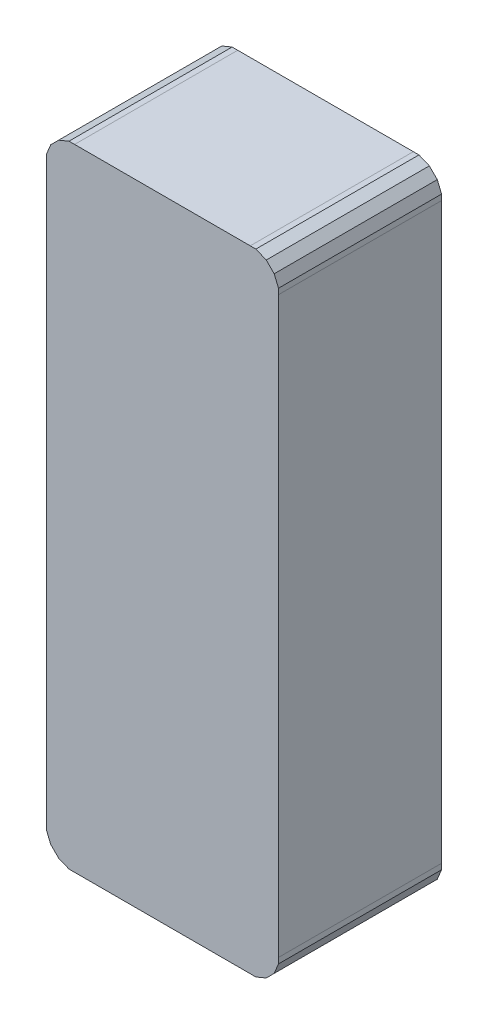
ISO-10303-21;
HEADER;
FILE_DESCRIPTION(('STEP AP214'),'2;1');
FILE_NAME('part.step','',(''),(''),'','','');
FILE_SCHEMA(('AUTOMOTIVE_DESIGN { 1 0 10303 214 1 1 1 1 }'));
ENDSEC;
DATA;
#1=APPLICATION_CONTEXT('core data for automotive mechanical design processes');
#2=APPLICATION_PROTOCOL_DEFINITION('international standard','automotive_design',2000,#1);
#3=PRODUCT_CONTEXT('',#1,'mechanical');
#4=PRODUCT('Part','Part','',(#3));
#5=PRODUCT_RELATED_PRODUCT_CATEGORY('part','',(#4));
#6=PRODUCT_DEFINITION_FORMATION('','',#4);
#7=PRODUCT_DEFINITION_CONTEXT('part definition',#1,'design');
#8=PRODUCT_DEFINITION('design','',#6,#7);
#9=PRODUCT_DEFINITION_SHAPE('','',#8);
#10=(LENGTH_UNIT() NAMED_UNIT(*) SI_UNIT(.MILLI.,.METRE.));
#11=(NAMED_UNIT(*) PLANE_ANGLE_UNIT() SI_UNIT($,.RADIAN.));
#12=(NAMED_UNIT(*) SI_UNIT($,.STERADIAN.) SOLID_ANGLE_UNIT());
#13=UNCERTAINTY_MEASURE_WITH_UNIT(LENGTH_MEASURE(1.E-05),#10,'distance_accuracy_value','');
#14=(GEOMETRIC_REPRESENTATION_CONTEXT(3) GLOBAL_UNCERTAINTY_ASSIGNED_CONTEXT((#13)) GLOBAL_UNIT_ASSIGNED_CONTEXT((#10,
#11,#12)) REPRESENTATION_CONTEXT('',''));
#15=CARTESIAN_POINT('',(0.,0.,0.));
#16=DIRECTION('',(0.,0.,1.));
#17=DIRECTION('',(1.,0.,0.));
#18=AXIS2_PLACEMENT_3D('',#15,#16,#17);
#19=CARTESIAN_POINT('',(1.84928002,-4.57546202,0.));
#20=DIRECTION('',(0.999999993544122,0.000113629906682714,0.));
#21=DIRECTION('',(0.000113629906682714,-0.999999993544122,0.));
#22=AXIS2_PLACEMENT_3D('',#19,#20,#21);
#23=PLANE('',#22);
#24=DIRECTION('',(0.,0.,1.));
#25=VECTOR('',#24,1.);
#26=CARTESIAN_POINT('',(1.84928002,-4.57546202,0.));
#27=LINE('',#26,#25);
#28=CARTESIAN_POINT('',(1.84928002,-4.57546202,0.));
#29=VERTEX_POINT('',#28);
#30=CARTESIAN_POINT('',(1.84928002,-4.57546202,2.59999988));
#31=VERTEX_POINT('',#30);
#32=EDGE_CURVE('E11',#29,#31,#27,.T.);
#33=ORIENTED_EDGE('',*,*,#32,.T.);
#34=DIRECTION('',(0.000113629906682714,-0.999999993544122,0.));
#35=VECTOR('',#34,1.);
#36=CARTESIAN_POINT('',(1.84928002,-4.57546202,2.59999988));
#37=LINE('',#36,#35);
#38=CARTESIAN_POINT('',(1.84929018,-4.6648751,2.59999988));
#39=VERTEX_POINT('',#38);
#40=EDGE_CURVE('E24',#31,#39,#37,.T.);
#41=ORIENTED_EDGE('',*,*,#40,.T.);
#42=DIRECTION('',(0.,0.,1.));
#43=VECTOR('',#42,1.);
#44=CARTESIAN_POINT('',(1.84929018,-4.6648751,0.));
#45=LINE('',#44,#43);
#46=CARTESIAN_POINT('',(1.84929018,-4.6648751,0.));
#47=VERTEX_POINT('',#46);
#48=EDGE_CURVE('E421',#47,#39,#45,.T.);
#49=ORIENTED_EDGE('',*,*,#48,.F.);
#50=DIRECTION('',(0.000113629906682714,-0.999999993544122,0.));
#51=VECTOR('',#50,1.);
#52=CARTESIAN_POINT('',(1.84928002,-4.57546202,0.));
#53=LINE('',#52,#51);
#54=EDGE_CURVE('E419',#29,#47,#53,.T.);
#55=ORIENTED_EDGE('',*,*,#54,.F.);
#56=EDGE_LOOP('',(#33,#41,#49,#55));
#57=FACE_BOUND('',#56,.T.);
#58=ADVANCED_FACE('F17',(#57),#23,.T.);
#59=CARTESIAN_POINT('',(1.84929018,-4.6648751,0.));
#60=DIRECTION('',(0.923919378216461,-0.382587222154777,0.));
#61=DIRECTION('',(-0.382587222154777,-0.923919378216461,0.));
#62=AXIS2_PLACEMENT_3D('',#59,#60,#61);
#63=PLANE('',#62);
#64=ORIENTED_EDGE('',*,*,#48,.T.);
#65=DIRECTION('',(-0.382587222154777,-0.923919378216461,0.));
#66=VECTOR('',#65,1.);
#67=CARTESIAN_POINT('',(1.84929018,-4.6648751,2.59999988));
#68=LINE('',#67,#66);
#69=CARTESIAN_POINT('',(1.78087528,-4.83009194,2.59999988));
#70=VERTEX_POINT('',#69);
#71=EDGE_CURVE('E417',#39,#70,#68,.T.);
#72=ORIENTED_EDGE('',*,*,#71,.T.);
#73=DIRECTION('',(0.,0.,1.));
#74=VECTOR('',#73,1.);
#75=CARTESIAN_POINT('',(1.78087528,-4.83009194,0.));
#76=LINE('',#75,#74);
#77=CARTESIAN_POINT('',(1.78087528,-4.83009194,0.));
#78=VERTEX_POINT('',#77);
#79=EDGE_CURVE('E414',#78,#70,#76,.T.);
#80=ORIENTED_EDGE('',*,*,#79,.F.);
#81=DIRECTION('',(-0.382587222154777,-0.923919378216461,0.));
#82=VECTOR('',#81,1.);
#83=CARTESIAN_POINT('',(1.84929018,-4.6648751,0.));
#84=LINE('',#83,#82);
#85=EDGE_CURVE('E411',#47,#78,#84,.T.);
#86=ORIENTED_EDGE('',*,*,#85,.F.);
#87=EDGE_LOOP('',(#64,#72,#80,#86));
#88=FACE_BOUND('',#87,.T.);
#89=ADVANCED_FACE('F427',(#88),#63,.T.);
#90=CARTESIAN_POINT('',(1.78087528,-4.83009194,0.));
#91=DIRECTION('',(0.707163595164945,-0.707049962642945,0.));
#92=DIRECTION('',(-0.707049962642945,-0.707163595164945,0.));
#93=AXIS2_PLACEMENT_3D('',#90,#91,#92);
#94=PLANE('',#93);
#95=ORIENTED_EDGE('',*,*,#79,.T.);
#96=DIRECTION('',(-0.707049962642945,-0.707163595164945,0.));
#97=VECTOR('',#96,1.);
#98=CARTESIAN_POINT('',(1.78087528,-4.83009194,2.59999988));
#99=LINE('',#98,#97);
#100=CARTESIAN_POINT('',(1.65443916,-4.95654838,2.59999988));
#101=VERTEX_POINT('',#100);
#102=EDGE_CURVE('E409',#70,#101,#99,.T.);
#103=ORIENTED_EDGE('',*,*,#102,.T.);
#104=DIRECTION('',(0.,0.,1.));
#105=VECTOR('',#104,1.);
#106=CARTESIAN_POINT('',(1.65443916,-4.95654838,0.));
#107=LINE('',#106,#105);
#108=CARTESIAN_POINT('',(1.65443916,-4.95654838,0.));
#109=VERTEX_POINT('',#108);
#110=EDGE_CURVE('E406',#109,#101,#107,.T.);
#111=ORIENTED_EDGE('',*,*,#110,.F.);
#112=DIRECTION('',(-0.707049962642945,-0.707163595164945,0.));
#113=VECTOR('',#112,1.);
#114=CARTESIAN_POINT('',(1.78087528,-4.83009194,0.));
#115=LINE('',#114,#113);
#116=EDGE_CURVE('E403',#78,#109,#115,.T.);
#117=ORIENTED_EDGE('',*,*,#116,.F.);
#118=EDGE_LOOP('',(#95,#103,#111,#117));
#119=FACE_BOUND('',#118,.T.);
#120=ADVANCED_FACE('F433',(#119),#94,.T.);
#121=CARTESIAN_POINT('',(1.65443916,-4.95654838,0.));
#122=DIRECTION('',(0.382745696709142,-0.923853739317341,0.));
#123=DIRECTION('',(-0.923853739317341,-0.382745696709142,0.));
#124=AXIS2_PLACEMENT_3D('',#121,#122,#123);
#125=PLANE('',#124);
#126=ORIENTED_EDGE('',*,*,#110,.T.);
#127=DIRECTION('',(-0.923853739317341,-0.382745696709142,0.));
#128=VECTOR('',#127,1.);
#129=CARTESIAN_POINT('',(1.65443916,-4.95654838,2.59999988));
#130=LINE('',#129,#128);
#131=CARTESIAN_POINT('',(1.48923502,-5.02499122,2.59999988));
#132=VERTEX_POINT('',#131);
#133=EDGE_CURVE('E401',#101,#132,#130,.T.);
#134=ORIENTED_EDGE('',*,*,#133,.T.);
#135=DIRECTION('',(0.,0.,1.));
#136=VECTOR('',#135,1.);
#137=CARTESIAN_POINT('',(1.48923502,-5.02499122,0.));
#138=LINE('',#137,#136);
#139=CARTESIAN_POINT('',(1.48923502,-5.02499122,0.));
#140=VERTEX_POINT('',#139);
#141=EDGE_CURVE('E398',#140,#132,#138,.T.);
#142=ORIENTED_EDGE('',*,*,#141,.F.);
#143=DIRECTION('',(-0.923853739317341,-0.382745696709142,0.));
#144=VECTOR('',#143,1.);
#145=CARTESIAN_POINT('',(1.65443916,-4.95654838,0.));
#146=LINE('',#145,#144);
#147=EDGE_CURVE('E395',#109,#140,#146,.T.);
#148=ORIENTED_EDGE('',*,*,#147,.F.);
#149=EDGE_LOOP('',(#126,#134,#142,#148));
#150=FACE_BOUND('',#149,.T.);
#151=ADVANCED_FACE('F437',(#150),#125,.T.);
#152=CARTESIAN_POINT('',(1.48923502,-5.02499122,0.));
#153=DIRECTION('',(2.8407476882316E-05,-0.999999999596508,0.));
#154=DIRECTION('',(-0.999999999596508,-2.8407476882316E-05,0.));
#155=AXIS2_PLACEMENT_3D('',#152,#153,#154);
#156=PLANE('',#155);
#157=ORIENTED_EDGE('',*,*,#141,.T.);
#158=DIRECTION('',(-0.999999999596508,-2.8407476882316E-05,0.));
#159=VECTOR('',#158,1.);
#160=CARTESIAN_POINT('',(1.48923502,-5.02499122,2.59999988));
#161=LINE('',#160,#159);
#162=CARTESIAN_POINT('',(1.39982194,-5.02499376,2.59999988));
#163=VERTEX_POINT('',#162);
#164=EDGE_CURVE('E393',#132,#163,#161,.T.);
#165=ORIENTED_EDGE('',*,*,#164,.T.);
#166=DIRECTION('',(0.,0.,1.));
#167=VECTOR('',#166,1.);
#168=CARTESIAN_POINT('',(1.39982194,-5.02499376,0.));
#169=LINE('',#168,#167);
#170=CARTESIAN_POINT('',(1.39982194,-5.02499376,0.));
#171=VERTEX_POINT('',#170);
#172=EDGE_CURVE('E390',#171,#163,#169,.T.);
#173=ORIENTED_EDGE('',*,*,#172,.F.);
#174=DIRECTION('',(-0.999999999596508,-2.8407476882316E-05,0.));
#175=VECTOR('',#174,1.);
#176=CARTESIAN_POINT('',(1.48923502,-5.02499122,0.));
#177=LINE('',#176,#175);
#178=EDGE_CURVE('E387',#140,#171,#177,.T.);
#179=ORIENTED_EDGE('',*,*,#178,.F.);
#180=EDGE_LOOP('',(#157,#165,#173,#179));
#181=FACE_BOUND('',#180,.T.);
#182=ADVANCED_FACE('F441',(#181),#156,.T.);
#183=CARTESIAN_POINT('',(1.39982194,-5.02499376,0.));
#184=DIRECTION('',(0.0830454797384208,-0.99654575825449,0.));
#185=DIRECTION('',(-0.99654575825449,-0.0830454797384208,0.));
#186=AXIS2_PLACEMENT_3D('',#183,#184,#185);
#187=PLANE('',#186);
#188=ORIENTED_EDGE('',*,*,#172,.T.);
#189=DIRECTION('',(-0.99654575825449,-0.0830454797384208,0.));
#190=VECTOR('',#189,1.);
#191=CARTESIAN_POINT('',(1.39982194,-5.02499376,2.59999988));
#192=LINE('',#191,#190);
#193=CARTESIAN_POINT('',(1.39979146,-5.0249963,2.59999988));
#194=VERTEX_POINT('',#193);
#195=EDGE_CURVE('E385',#163,#194,#192,.T.);
#196=ORIENTED_EDGE('',*,*,#195,.T.);
#197=DIRECTION('',(0.,0.,1.));
#198=VECTOR('',#197,1.);
#199=CARTESIAN_POINT('',(1.39979146,-5.0249963,0.));
#200=LINE('',#199,#198);
#201=CARTESIAN_POINT('',(1.39979146,-5.0249963,0.));
#202=VERTEX_POINT('',#201);
#203=EDGE_CURVE('E382',#202,#194,#200,.T.);
#204=ORIENTED_EDGE('',*,*,#203,.F.);
#205=DIRECTION('',(-0.99654575825449,-0.0830454797384208,0.));
#206=VECTOR('',#205,1.);
#207=CARTESIAN_POINT('',(1.39982194,-5.02499376,0.));
#208=LINE('',#207,#206);
#209=EDGE_CURVE('E379',#171,#202,#208,.T.);
#210=ORIENTED_EDGE('',*,*,#209,.F.);
#211=EDGE_LOOP('',(#188,#196,#204,#210));
#212=FACE_BOUND('',#211,.T.);
#213=ADVANCED_FACE('F444',(#212),#187,.T.);
#214=CARTESIAN_POINT('',(1.39979146,-5.0249963,0.));
#215=DIRECTION('',(0.,-1.,0.));
#216=DIRECTION('',(-1.,0.,0.));
#217=AXIS2_PLACEMENT_3D('',#214,#215,#216);
#218=PLANE('',#217);
#219=ORIENTED_EDGE('',*,*,#203,.T.);
#220=DIRECTION('',(-1.,0.,0.));
#221=VECTOR('',#220,1.);
#222=CARTESIAN_POINT('',(1.39979146,-5.0249963,2.59999988));
#223=LINE('',#222,#221);
#224=CARTESIAN_POINT('',(-1.40021056,-5.0249963,2.59999988));
#225=VERTEX_POINT('',#224);
#226=EDGE_CURVE('E377',#194,#225,#223,.T.);
#227=ORIENTED_EDGE('',*,*,#226,.T.);
#228=DIRECTION('',(0.,0.,1.));
#229=VECTOR('',#228,1.);
#230=CARTESIAN_POINT('',(-1.40021056,-5.0249963,0.));
#231=LINE('',#230,#229);
#232=CARTESIAN_POINT('',(-1.40021056,-5.0249963,0.));
#233=VERTEX_POINT('',#232);
#234=EDGE_CURVE('E374',#233,#225,#231,.T.);
#235=ORIENTED_EDGE('',*,*,#234,.F.);
#236=DIRECTION('',(-1.,0.,0.));
#237=VECTOR('',#236,1.);
#238=CARTESIAN_POINT('',(1.39979146,-5.0249963,0.));
#239=LINE('',#238,#237);
#240=EDGE_CURVE('E371',#202,#233,#239,.T.);
#241=ORIENTED_EDGE('',*,*,#240,.F.);
#242=EDGE_LOOP('',(#219,#227,#235,#241));
#243=FACE_BOUND('',#242,.T.);
#244=ADVANCED_FACE('F449',(#243),#218,.T.);
#245=CARTESIAN_POINT('',(-1.40021056,-5.0249963,0.));
#246=DIRECTION('',(2.84098979634325E-05,-0.999999999596439,0.));
#247=DIRECTION('',(-0.999999999596439,-2.84098979634325E-05,0.));
#248=AXIS2_PLACEMENT_3D('',#245,#246,#247);
#249=PLANE('',#248);
#250=ORIENTED_EDGE('',*,*,#234,.T.);
#251=DIRECTION('',(-0.999999999596439,-2.84098979634325E-05,0.));
#252=VECTOR('',#251,1.);
#253=CARTESIAN_POINT('',(-1.40021056,-5.0249963,2.59999988));
#254=LINE('',#253,#252);
#255=CARTESIAN_POINT('',(-1.48961602,-5.02499884,2.59999988));
#256=VERTEX_POINT('',#255);
#257=EDGE_CURVE('E369',#225,#256,#254,.T.);
#258=ORIENTED_EDGE('',*,*,#257,.T.);
#259=DIRECTION('',(0.,0.,1.));
#260=VECTOR('',#259,1.);
#261=CARTESIAN_POINT('',(-1.48961602,-5.02499884,0.));
#262=LINE('',#261,#260);
#263=CARTESIAN_POINT('',(-1.48961602,-5.02499884,0.));
#264=VERTEX_POINT('',#263);
#265=EDGE_CURVE('E366',#264,#256,#262,.T.);
#266=ORIENTED_EDGE('',*,*,#265,.F.);
#267=DIRECTION('',(-0.999999999596439,-2.84098979634325E-05,0.));
#268=VECTOR('',#267,1.);
#269=CARTESIAN_POINT('',(-1.40021056,-5.0249963,0.));
#270=LINE('',#269,#268);
#271=EDGE_CURVE('E363',#233,#264,#270,.T.);
#272=ORIENTED_EDGE('',*,*,#271,.F.);
#273=EDGE_LOOP('',(#250,#258,#266,#272));
#274=FACE_BOUND('',#273,.T.);
#275=ADVANCED_FACE('F453',(#274),#249,.T.);
#276=CARTESIAN_POINT('',(-1.48961602,-5.02499884,0.));
#277=DIRECTION('',(-0.382685077513852,-0.923878851066642,0.));
#278=DIRECTION('',(-0.923878851066642,0.382685077513852,0.));
#279=AXIS2_PLACEMENT_3D('',#276,#277,#278);
#280=PLANE('',#279);
#281=ORIENTED_EDGE('',*,*,#265,.T.);
#282=DIRECTION('',(-0.923878851066642,0.382685077513852,0.));
#283=VECTOR('',#282,1.);
#284=CARTESIAN_POINT('',(-1.48961602,-5.02499884,2.59999988));
#285=LINE('',#284,#283);
#286=CARTESIAN_POINT('',(-1.65482016,-4.9565687,2.59999988));
#287=VERTEX_POINT('',#286);
#288=EDGE_CURVE('E361',#256,#287,#285,.T.);
#289=ORIENTED_EDGE('',*,*,#288,.T.);
#290=DIRECTION('',(0.,0.,1.));
#291=VECTOR('',#290,1.);
#292=CARTESIAN_POINT('',(-1.65482016,-4.9565687,0.));
#293=LINE('',#292,#291);
#294=CARTESIAN_POINT('',(-1.65482016,-4.9565687,0.));
#295=VERTEX_POINT('',#294);
#296=EDGE_CURVE('E358',#295,#287,#293,.T.);
#297=ORIENTED_EDGE('',*,*,#296,.F.);
#298=DIRECTION('',(-0.923878851066642,0.382685077513852,0.));
#299=VECTOR('',#298,1.);
#300=CARTESIAN_POINT('',(-1.48961602,-5.02499884,0.));
#301=LINE('',#300,#299);
#302=EDGE_CURVE('E355',#264,#295,#301,.T.);
#303=ORIENTED_EDGE('',*,*,#302,.F.);
#304=EDGE_LOOP('',(#281,#289,#297,#303));
#305=FACE_BOUND('',#304,.T.);
#306=ADVANCED_FACE('F457',(#305),#280,.T.);
#307=CARTESIAN_POINT('',(-1.65482016,-4.9565687,0.));
#308=DIRECTION('',(-0.707106781186548,-0.707106781186548,0.));
#309=DIRECTION('',(-0.707106781186548,0.707106781186548,0.));
#310=AXIS2_PLACEMENT_3D('',#307,#308,#309);
#311=PLANE('',#310);
#312=ORIENTED_EDGE('',*,*,#296,.T.);
#313=DIRECTION('',(-0.707106781186548,0.707106781186548,0.));
#314=VECTOR('',#313,1.);
#315=CARTESIAN_POINT('',(-1.65482016,-4.9565687,2.59999988));
#316=LINE('',#315,#314);
#317=CARTESIAN_POINT('',(-1.78126136,-4.8301275,2.59999988));
#318=VERTEX_POINT('',#317);
#319=EDGE_CURVE('E353',#287,#318,#316,.T.);
#320=ORIENTED_EDGE('',*,*,#319,.T.);
#321=DIRECTION('',(0.,0.,1.));
#322=VECTOR('',#321,1.);
#323=CARTESIAN_POINT('',(-1.78126136,-4.8301275,0.));
#324=LINE('',#323,#322);
#325=CARTESIAN_POINT('',(-1.78126136,-4.8301275,0.));
#326=VERTEX_POINT('',#325);
#327=EDGE_CURVE('E350',#326,#318,#324,.T.);
#328=ORIENTED_EDGE('',*,*,#327,.F.);
#329=DIRECTION('',(-0.707106781186548,0.707106781186548,0.));
#330=VECTOR('',#329,1.);
#331=CARTESIAN_POINT('',(-1.65482016,-4.9565687,0.));
#332=LINE('',#331,#330);
#333=EDGE_CURVE('E347',#295,#326,#332,.T.);
#334=ORIENTED_EDGE('',*,*,#333,.F.);
#335=EDGE_LOOP('',(#312,#320,#328,#334));
#336=FACE_BOUND('',#335,.T.);
#337=ADVANCED_FACE('F460',(#336),#311,.T.);
#338=CARTESIAN_POINT('',(-1.78126136,-4.8301275,0.));
#339=DIRECTION('',(-0.923878851066642,-0.382685077513852,0.));
#340=DIRECTION('',(-0.382685077513852,0.923878851066642,0.));
#341=AXIS2_PLACEMENT_3D('',#338,#339,#340);
#342=PLANE('',#341);
#343=ORIENTED_EDGE('',*,*,#327,.T.);
#344=DIRECTION('',(-0.382685077513852,0.923878851066642,0.));
#345=VECTOR('',#344,1.);
#346=CARTESIAN_POINT('',(-1.78126136,-4.8301275,2.59999988));
#347=LINE('',#346,#345);
#348=CARTESIAN_POINT('',(-1.8496915,-4.66492336,2.59999988));
#349=VERTEX_POINT('',#348);
#350=EDGE_CURVE('E345',#318,#349,#347,.T.);
#351=ORIENTED_EDGE('',*,*,#350,.T.);
#352=DIRECTION('',(0.,0.,1.));
#353=VECTOR('',#352,1.);
#354=CARTESIAN_POINT('',(-1.8496915,-4.66492336,0.));
#355=LINE('',#354,#353);
#356=CARTESIAN_POINT('',(-1.8496915,-4.66492336,0.));
#357=VERTEX_POINT('',#356);
#358=EDGE_CURVE('E342',#357,#349,#355,.T.);
#359=ORIENTED_EDGE('',*,*,#358,.F.);
#360=DIRECTION('',(-0.382685077513852,0.923878851066642,0.));
#361=VECTOR('',#360,1.);
#362=CARTESIAN_POINT('',(-1.78126136,-4.8301275,0.));
#363=LINE('',#362,#361);
#364=EDGE_CURVE('E339',#326,#357,#363,.T.);
#365=ORIENTED_EDGE('',*,*,#364,.F.);
#366=EDGE_LOOP('',(#343,#351,#359,#365));
#367=FACE_BOUND('',#366,.T.);
#368=ADVANCED_FACE('F465',(#367),#342,.T.);
#369=CARTESIAN_POINT('',(-1.8496915,-4.66492336,0.));
#370=DIRECTION('',(-0.999999999596462,2.84090908640631E-05,0.));
#371=DIRECTION('',(2.84090908640631E-05,0.999999999596462,0.));
#372=AXIS2_PLACEMENT_3D('',#369,#370,#371);
#373=PLANE('',#372);
#374=ORIENTED_EDGE('',*,*,#358,.T.);
#375=DIRECTION('',(2.84090908640631E-05,0.999999999596462,0.));
#376=VECTOR('',#375,1.);
#377=CARTESIAN_POINT('',(-1.8496915,-4.66492336,2.59999988));
#378=LINE('',#377,#376);
#379=CARTESIAN_POINT('',(-1.84968896,-4.57551536,2.59999988));
#380=VERTEX_POINT('',#379);
#381=EDGE_CURVE('E337',#349,#380,#378,.T.);
#382=ORIENTED_EDGE('',*,*,#381,.T.);
#383=DIRECTION('',(0.,0.,1.));
#384=VECTOR('',#383,1.);
#385=CARTESIAN_POINT('',(-1.84968896,-4.57551536,0.));
#386=LINE('',#385,#384);
#387=CARTESIAN_POINT('',(-1.84968896,-4.57551536,0.));
#388=VERTEX_POINT('',#387);
#389=EDGE_CURVE('E334',#388,#380,#386,.T.);
#390=ORIENTED_EDGE('',*,*,#389,.F.);
#391=DIRECTION('',(2.84090908640631E-05,0.999999999596462,0.));
#392=VECTOR('',#391,1.);
#393=CARTESIAN_POINT('',(-1.8496915,-4.66492336,0.));
#394=LINE('',#393,#392);
#395=EDGE_CURVE('E331',#357,#388,#394,.T.);
#396=ORIENTED_EDGE('',*,*,#395,.F.);
#397=EDGE_LOOP('',(#374,#382,#390,#396));
#398=FACE_BOUND('',#397,.T.);
#399=ADVANCED_FACE('F469',(#398),#373,.T.);
#400=CARTESIAN_POINT('',(-1.84968896,-4.57551536,0.));
#401=DIRECTION('',(-0.707106781186548,-0.707106781186548,0.));
#402=DIRECTION('',(-0.707106781186548,0.707106781186548,0.));
#403=AXIS2_PLACEMENT_3D('',#400,#401,#402);
#404=PLANE('',#403);
#405=ORIENTED_EDGE('',*,*,#389,.T.);
#406=DIRECTION('',(-0.707106781186548,0.707106781186548,0.));
#407=VECTOR('',#406,1.);
#408=CARTESIAN_POINT('',(-1.84968896,-4.57551536,2.59999988));
#409=LINE('',#408,#407);
#410=CARTESIAN_POINT('',(-1.84972198,-4.57548234,2.59999988));
#411=VERTEX_POINT('',#410);
#412=EDGE_CURVE('E329',#380,#411,#409,.T.);
#413=ORIENTED_EDGE('',*,*,#412,.T.);
#414=DIRECTION('',(0.,0.,1.));
#415=VECTOR('',#414,1.);
#416=CARTESIAN_POINT('',(-1.84972198,-4.57548234,0.));
#417=LINE('',#416,#415);
#418=CARTESIAN_POINT('',(-1.84972198,-4.57548234,0.));
#419=VERTEX_POINT('',#418);
#420=EDGE_CURVE('E326',#419,#411,#417,.T.);
#421=ORIENTED_EDGE('',*,*,#420,.F.);
#422=DIRECTION('',(-0.707106781186548,0.707106781186548,0.));
#423=VECTOR('',#422,1.);
#424=CARTESIAN_POINT('',(-1.84968896,-4.57551536,0.));
#425=LINE('',#424,#423);
#426=EDGE_CURVE('E323',#388,#419,#425,.T.);
#427=ORIENTED_EDGE('',*,*,#426,.F.);
#428=EDGE_LOOP('',(#405,#413,#421,#427));
#429=FACE_BOUND('',#428,.T.);
#430=ADVANCED_FACE('F473',(#429),#404,.T.);
#431=CARTESIAN_POINT('',(-1.84972198,-4.57548234,0.));
#432=DIRECTION('',(-0.999999999999962,2.77581003360389E-07,0.));
#433=DIRECTION('',(2.77581003360389E-07,0.999999999999962,0.));
#434=AXIS2_PLACEMENT_3D('',#431,#432,#433);
#435=PLANE('',#434);
#436=ORIENTED_EDGE('',*,*,#420,.T.);
#437=DIRECTION('',(2.77581003360389E-07,0.999999999999962,0.));
#438=VECTOR('',#437,1.);
#439=CARTESIAN_POINT('',(-1.84972198,-4.57548234,2.59999988));
#440=LINE('',#439,#438);
#441=CARTESIAN_POINT('',(-1.84971944,4.57499974,2.59999988));
#442=VERTEX_POINT('',#441);
#443=EDGE_CURVE('E321',#411,#442,#440,.T.);
#444=ORIENTED_EDGE('',*,*,#443,.T.);
#445=DIRECTION('',(0.,0.,1.));
#446=VECTOR('',#445,1.);
#447=CARTESIAN_POINT('',(-1.84971944,4.57499974,0.));
#448=LINE('',#447,#446);
#449=CARTESIAN_POINT('',(-1.84971944,4.57499974,0.));
#450=VERTEX_POINT('',#449);
#451=EDGE_CURVE('E318',#450,#442,#448,.T.);
#452=ORIENTED_EDGE('',*,*,#451,.F.);
#453=DIRECTION('',(2.77581003360389E-07,0.999999999999962,0.));
#454=VECTOR('',#453,1.);
#455=CARTESIAN_POINT('',(-1.84972198,-4.57548234,0.));
#456=LINE('',#455,#454);
#457=EDGE_CURVE('E315',#419,#450,#456,.T.);
#458=ORIENTED_EDGE('',*,*,#457,.F.);
#459=EDGE_LOOP('',(#436,#444,#452,#458));
#460=FACE_BOUND('',#459,.T.);
#461=ADVANCED_FACE('F476',(#460),#435,.T.);
#462=CARTESIAN_POINT('',(-1.84971944,4.57499974,0.));
#463=DIRECTION('',(-0.999999838777175,-0.0005678429565966,0.));
#464=DIRECTION('',(-0.0005678429565966,0.999999838777175,0.));
#465=AXIS2_PLACEMENT_3D('',#462,#463,#464);
#466=PLANE('',#465);
#467=ORIENTED_EDGE('',*,*,#451,.T.);
#468=DIRECTION('',(-0.0005678429565966,0.999999838777175,0.));
#469=VECTOR('',#468,1.);
#470=CARTESIAN_POINT('',(-1.84971944,4.57499974,2.59999988));
#471=LINE('',#470,#469);
#472=CARTESIAN_POINT('',(-1.84977024,4.66446108,2.59999988));
#473=VERTEX_POINT('',#472);
#474=EDGE_CURVE('E313',#442,#473,#471,.T.);
#475=ORIENTED_EDGE('',*,*,#474,.T.);
#476=DIRECTION('',(0.,0.,1.));
#477=VECTOR('',#476,1.);
#478=CARTESIAN_POINT('',(-1.84977024,4.66446108,0.));
#479=LINE('',#478,#477);
#480=CARTESIAN_POINT('',(-1.84977024,4.66446108,0.));
#481=VERTEX_POINT('',#480);
#482=EDGE_CURVE('E310',#481,#473,#479,.T.);
#483=ORIENTED_EDGE('',*,*,#482,.F.);
#484=DIRECTION('',(-0.0005678429565966,0.999999838777175,0.));
#485=VECTOR('',#484,1.);
#486=CARTESIAN_POINT('',(-1.84971944,4.57499974,0.));
#487=LINE('',#486,#485);
#488=EDGE_CURVE('E307',#450,#481,#487,.T.);
#489=ORIENTED_EDGE('',*,*,#488,.F.);
#490=EDGE_LOOP('',(#467,#475,#483,#489));
#491=FACE_BOUND('',#490,.T.);
#492=ADVANCED_FACE('F481',(#491),#466,.T.);
#493=CARTESIAN_POINT('',(-1.84977024,4.66446108,0.));
#494=DIRECTION('',(-0.924083401297023,0.38219087828901,0.));
#495=DIRECTION('',(0.38219087828901,0.924083401297023,0.));
#496=AXIS2_PLACEMENT_3D('',#493,#494,#495);
#497=PLANE('',#496);
#498=ORIENTED_EDGE('',*,*,#482,.T.);
#499=DIRECTION('',(0.38219087828901,0.924083401297023,0.));
#500=VECTOR('',#499,1.);
#501=CARTESIAN_POINT('',(-1.84977024,4.66446108,2.59999988));
#502=LINE('',#501,#500);
#503=CARTESIAN_POINT('',(-1.78138582,4.82980492,2.59999988));
#504=VERTEX_POINT('',#503);
#505=EDGE_CURVE('E305',#473,#504,#502,.T.);
#506=ORIENTED_EDGE('',*,*,#505,.T.);
#507=DIRECTION('',(0.,0.,1.));
#508=VECTOR('',#507,1.);
#509=CARTESIAN_POINT('',(-1.78138582,4.82980492,0.));
#510=LINE('',#509,#508);
#511=CARTESIAN_POINT('',(-1.78138582,4.82980492,0.));
#512=VERTEX_POINT('',#511);
#513=EDGE_CURVE('E302',#512,#504,#510,.T.);
#514=ORIENTED_EDGE('',*,*,#513,.F.);
#515=DIRECTION('',(0.38219087828901,0.924083401297023,0.));
#516=VECTOR('',#515,1.);
#517=CARTESIAN_POINT('',(-1.84977024,4.66446108,0.));
#518=LINE('',#517,#516);
#519=EDGE_CURVE('E299',#481,#512,#518,.T.);
#520=ORIENTED_EDGE('',*,*,#519,.F.);
#521=EDGE_LOOP('',(#498,#506,#514,#520));
#522=FACE_BOUND('',#521,.T.);
#523=ADVANCED_FACE('F485',(#522),#497,.T.);
#524=CARTESIAN_POINT('',(-1.78138582,4.82980492,0.));
#525=DIRECTION('',(-0.707468684903795,0.706744692148795,0.));
#526=DIRECTION('',(0.706744692148795,0.707468684903795,0.));
#527=AXIS2_PLACEMENT_3D('',#524,#525,#526);
#528=PLANE('',#527);
#529=ORIENTED_EDGE('',*,*,#513,.T.);
#530=DIRECTION('',(0.706744692148795,0.707468684903795,0.));
#531=VECTOR('',#530,1.);
#532=CARTESIAN_POINT('',(-1.78138582,4.82980492,2.59999988));
#533=LINE('',#532,#531);
#534=CARTESIAN_POINT('',(-1.65493192,4.95638836,2.59999988));
#535=VERTEX_POINT('',#534);
#536=EDGE_CURVE('E297',#504,#535,#533,.T.);
#537=ORIENTED_EDGE('',*,*,#536,.T.);
#538=DIRECTION('',(0.,0.,1.));
#539=VECTOR('',#538,1.);
#540=CARTESIAN_POINT('',(-1.65493192,4.95638836,0.));
#541=LINE('',#540,#539);
#542=CARTESIAN_POINT('',(-1.65493192,4.95638836,0.));
#543=VERTEX_POINT('',#542);
#544=EDGE_CURVE('E294',#543,#535,#541,.T.);
#545=ORIENTED_EDGE('',*,*,#544,.F.);
#546=DIRECTION('',(0.706744692148795,0.707468684903795,0.));
#547=VECTOR('',#546,1.);
#548=CARTESIAN_POINT('',(-1.78138582,4.82980492,0.));
#549=LINE('',#548,#547);
#550=EDGE_CURVE('E291',#512,#543,#549,.T.);
#551=ORIENTED_EDGE('',*,*,#550,.F.);
#552=EDGE_LOOP('',(#529,#537,#545,#551));
#553=FACE_BOUND('',#552,.T.);
#554=ADVANCED_FACE('F489',(#553),#528,.T.);
#555=CARTESIAN_POINT('',(-1.65493192,4.95638836,0.));
#556=DIRECTION('',(-0.38314826593391,0.923686855114783,0.));
#557=DIRECTION('',(0.923686855114783,0.38314826593391,0.));
#558=AXIS2_PLACEMENT_3D('',#555,#556,#557);
#559=PLANE('',#558);
#560=ORIENTED_EDGE('',*,*,#544,.T.);
#561=DIRECTION('',(0.923686855114783,0.38314826593391,0.));
#562=VECTOR('',#561,1.);
#563=CARTESIAN_POINT('',(-1.65493192,4.95638836,2.59999988));
#564=LINE('',#563,#562);
#565=CARTESIAN_POINT('',(-1.48966174,5.02494296,2.59999988));
#566=VERTEX_POINT('',#565);
#567=EDGE_CURVE('E289',#535,#566,#564,.T.);
#568=ORIENTED_EDGE('',*,*,#567,.T.);
#569=DIRECTION('',(0.,0.,1.));
#570=VECTOR('',#569,1.);
#571=CARTESIAN_POINT('',(-1.48966174,5.02494296,0.));
#572=LINE('',#571,#570);
#573=CARTESIAN_POINT('',(-1.48966174,5.02494296,0.));
#574=VERTEX_POINT('',#573);
#575=EDGE_CURVE('E286',#574,#566,#572,.T.);
#576=ORIENTED_EDGE('',*,*,#575,.F.);
#577=DIRECTION('',(0.923686855114783,0.38314826593391,0.));
#578=VECTOR('',#577,1.);
#579=CARTESIAN_POINT('',(-1.65493192,4.95638836,0.));
#580=LINE('',#579,#578);
#581=EDGE_CURVE('E283',#543,#574,#580,.T.);
#582=ORIENTED_EDGE('',*,*,#581,.F.);
#583=EDGE_LOOP('',(#560,#568,#576,#582));
#584=FACE_BOUND('',#583,.T.);
#585=ADVANCED_FACE('F492',(#584),#559,.T.);
#586=CARTESIAN_POINT('',(-1.48966174,5.02494296,0.));
#587=DIRECTION('',(-0.00045426149423211,0.999999896823242,0.));
#588=DIRECTION('',(0.999999896823242,0.00045426149423211,0.));
#589=AXIS2_PLACEMENT_3D('',#586,#587,#588);
#590=PLANE('',#589);
#591=ORIENTED_EDGE('',*,*,#575,.T.);
#592=DIRECTION('',(0.999999896823242,0.00045426149423211,0.));
#593=VECTOR('',#592,1.);
#594=CARTESIAN_POINT('',(-1.48966174,5.02494296,2.59999988));
#595=LINE('',#594,#593);
#596=CARTESIAN_POINT('',(-1.40019786,5.0249836,2.59999988));
#597=VERTEX_POINT('',#596);
#598=EDGE_CURVE('E281',#566,#597,#595,.T.);
#599=ORIENTED_EDGE('',*,*,#598,.T.);
#600=DIRECTION('',(0.,0.,1.));
#601=VECTOR('',#600,1.);
#602=CARTESIAN_POINT('',(-1.40019786,5.0249836,0.));
#603=LINE('',#602,#601);
#604=CARTESIAN_POINT('',(-1.40019786,5.0249836,0.));
#605=VERTEX_POINT('',#604);
#606=EDGE_CURVE('E278',#605,#597,#603,.T.);
#607=ORIENTED_EDGE('',*,*,#606,.F.);
#608=DIRECTION('',(0.999999896823242,0.00045426149423211,0.));
#609=VECTOR('',#608,1.);
#610=CARTESIAN_POINT('',(-1.48966174,5.02494296,0.));
#611=LINE('',#610,#609);
#612=EDGE_CURVE('E275',#574,#605,#611,.T.);
#613=ORIENTED_EDGE('',*,*,#612,.F.);
#614=EDGE_LOOP('',(#591,#599,#607,#613));
#615=FACE_BOUND('',#614,.T.);
#616=ADVANCED_FACE('F497',(#615),#590,.T.);
#617=CARTESIAN_POINT('',(-1.40019786,5.0249836,0.));
#618=DIRECTION('',(-0.868243142167167,-0.496138938282095,0.));
#619=DIRECTION('',(-0.496138938282095,0.868243142167167,0.));
#620=AXIS2_PLACEMENT_3D('',#617,#618,#619);
#621=PLANE('',#620);
#622=ORIENTED_EDGE('',*,*,#606,.T.);
#623=DIRECTION('',(-0.496138938282095,0.868243142167167,0.));
#624=VECTOR('',#623,1.);
#625=CARTESIAN_POINT('',(-1.40019786,5.0249836,2.59999988));
#626=LINE('',#625,#624);
#627=CARTESIAN_POINT('',(-1.40020802,5.02500138,2.59999988));
#628=VERTEX_POINT('',#627);
#629=EDGE_CURVE('E273',#597,#628,#626,.T.);
#630=ORIENTED_EDGE('',*,*,#629,.T.);
#631=DIRECTION('',(0.,0.,1.));
#632=VECTOR('',#631,1.);
#633=CARTESIAN_POINT('',(-1.40020802,5.02500138,0.));
#634=LINE('',#633,#632);
#635=CARTESIAN_POINT('',(-1.40020802,5.02500138,0.));
#636=VERTEX_POINT('',#635);
#637=EDGE_CURVE('E270',#636,#628,#634,.T.);
#638=ORIENTED_EDGE('',*,*,#637,.F.);
#639=DIRECTION('',(-0.496138938282095,0.868243142167167,0.));
#640=VECTOR('',#639,1.);
#641=CARTESIAN_POINT('',(-1.40019786,5.0249836,0.));
#642=LINE('',#641,#640);
#643=EDGE_CURVE('E267',#605,#636,#642,.T.);
#644=ORIENTED_EDGE('',*,*,#643,.F.);
#645=EDGE_LOOP('',(#622,#630,#638,#644));
#646=FACE_BOUND('',#645,.T.);
#647=ADVANCED_FACE('F501',(#646),#621,.T.);
#648=CARTESIAN_POINT('',(-1.40020802,5.02500138,0.));
#649=DIRECTION('',(1.81428605161564E-06,0.999999999998354,0.));
#650=DIRECTION('',(0.999999999998354,-1.81428605161564E-06,0.));
#651=AXIS2_PLACEMENT_3D('',#648,#649,#650);
#652=PLANE('',#651);
#653=ORIENTED_EDGE('',*,*,#637,.T.);
#654=DIRECTION('',(0.999999999998354,-1.81428605161564E-06,0.));
#655=VECTOR('',#654,1.);
#656=CARTESIAN_POINT('',(-1.40020802,5.02500138,2.59999988));
#657=LINE('',#656,#655);
#658=CARTESIAN_POINT('',(1.39979146,5.0249963,2.59999988));
#659=VERTEX_POINT('',#658);
#660=EDGE_CURVE('E265',#628,#659,#657,.T.);
#661=ORIENTED_EDGE('',*,*,#660,.T.);
#662=DIRECTION('',(0.,0.,1.));
#663=VECTOR('',#662,1.);
#664=CARTESIAN_POINT('',(1.39979146,5.0249963,0.));
#665=LINE('',#664,#663);
#666=CARTESIAN_POINT('',(1.39979146,5.0249963,0.));
#667=VERTEX_POINT('',#666);
#668=EDGE_CURVE('E262',#667,#659,#665,.T.);
#669=ORIENTED_EDGE('',*,*,#668,.F.);
#670=DIRECTION('',(0.999999999998354,-1.81428605161564E-06,0.));
#671=VECTOR('',#670,1.);
#672=CARTESIAN_POINT('',(-1.40020802,5.02500138,0.));
#673=LINE('',#672,#671);
#674=EDGE_CURVE('E259',#636,#667,#673,.T.);
#675=ORIENTED_EDGE('',*,*,#674,.F.);
#676=EDGE_LOOP('',(#653,#661,#669,#675));
#677=FACE_BOUND('',#676,.T.);
#678=ADVANCED_FACE('F505',(#677),#652,.T.);
#679=CARTESIAN_POINT('',(1.39979146,5.0249963,0.));
#680=DIRECTION('',(-5.67552994470037E-05,0.999999998389418,0.));
#681=DIRECTION('',(0.999999998389418,5.67552994470037E-05,0.));
#682=AXIS2_PLACEMENT_3D('',#679,#680,#681);
#683=PLANE('',#682);
#684=ORIENTED_EDGE('',*,*,#668,.T.);
#685=DIRECTION('',(0.999999998389418,5.67552994470037E-05,0.));
#686=VECTOR('',#685,1.);
#687=CARTESIAN_POINT('',(1.39979146,5.0249963,2.59999988));
#688=LINE('',#687,#686);
#689=CARTESIAN_POINT('',(1.48929852,5.02500138,2.59999988));
#690=VERTEX_POINT('',#689);
#691=EDGE_CURVE('E257',#659,#690,#688,.T.);
#692=ORIENTED_EDGE('',*,*,#691,.T.);
#693=DIRECTION('',(0.,0.,1.));
#694=VECTOR('',#693,1.);
#695=CARTESIAN_POINT('',(1.48929852,5.02500138,0.));
#696=LINE('',#695,#694);
#697=CARTESIAN_POINT('',(1.48929852,5.02500138,0.));
#698=VERTEX_POINT('',#697);
#699=EDGE_CURVE('E254',#698,#690,#696,.T.);
#700=ORIENTED_EDGE('',*,*,#699,.F.);
#701=DIRECTION('',(0.999999998389418,5.67552994470037E-05,0.));
#702=VECTOR('',#701,1.);
#703=CARTESIAN_POINT('',(1.39979146,5.0249963,0.));
#704=LINE('',#703,#702);
#705=EDGE_CURVE('E251',#667,#698,#704,.T.);
#706=ORIENTED_EDGE('',*,*,#705,.F.);
#707=EDGE_LOOP('',(#684,#692,#700,#706));
#708=FACE_BOUND('',#707,.T.);
#709=ADVANCED_FACE('F508',(#708),#683,.T.);
#710=CARTESIAN_POINT('',(1.48929852,5.02500138,0.));
#711=DIRECTION('',(0.382657976302852,0.923890076346643,0.));
#712=DIRECTION('',(0.923890076346643,-0.382657976302852,0.));
#713=AXIS2_PLACEMENT_3D('',#710,#711,#712);
#714=PLANE('',#713);
#715=ORIENTED_EDGE('',*,*,#699,.T.);
#716=DIRECTION('',(0.923890076346643,-0.382657976302852,0.));
#717=VECTOR('',#716,1.);
#718=CARTESIAN_POINT('',(1.48929852,5.02500138,2.59999988));
#719=LINE('',#718,#717);
#720=CARTESIAN_POINT('',(1.65468808,4.95650012,2.59999988));
#721=VERTEX_POINT('',#720);
#722=EDGE_CURVE('E249',#690,#721,#719,.T.);
#723=ORIENTED_EDGE('',*,*,#722,.T.);
#724=DIRECTION('',(0.,0.,1.));
#725=VECTOR('',#724,1.);
#726=CARTESIAN_POINT('',(1.65468808,4.95650012,0.));
#727=LINE('',#726,#725);
#728=CARTESIAN_POINT('',(1.65468808,4.95650012,0.));
#729=VERTEX_POINT('',#728);
#730=EDGE_CURVE('E246',#729,#721,#727,.T.);
#731=ORIENTED_EDGE('',*,*,#730,.F.);
#732=DIRECTION('',(0.923890076346643,-0.382657976302852,0.));
#733=VECTOR('',#732,1.);
#734=CARTESIAN_POINT('',(1.48929852,5.02500138,0.));
#735=LINE('',#734,#733);
#736=EDGE_CURVE('E243',#698,#729,#735,.T.);
#737=ORIENTED_EDGE('',*,*,#736,.F.);
#738=EDGE_LOOP('',(#715,#723,#731,#737));
#739=FACE_BOUND('',#738,.T.);
#740=ADVANCED_FACE('F513',(#739),#714,.T.);
#741=CARTESIAN_POINT('',(1.65468808,4.95650012,0.));
#742=DIRECTION('',(0.707106781186548,0.707106781186548,0.));
#743=DIRECTION('',(0.707106781186548,-0.707106781186548,0.));
#744=AXIS2_PLACEMENT_3D('',#741,#742,#743);
#745=PLANE('',#744);
#746=ORIENTED_EDGE('',*,*,#730,.T.);
#747=DIRECTION('',(0.707106781186548,-0.707106781186548,0.));
#748=VECTOR('',#747,1.);
#749=CARTESIAN_POINT('',(1.65468808,4.95650012,2.59999988));
#750=LINE('',#749,#748);
#751=CARTESIAN_POINT('',(1.78126898,4.82991922,2.59999988));
#752=VERTEX_POINT('',#751);
#753=EDGE_CURVE('E241',#721,#752,#750,.T.);
#754=ORIENTED_EDGE('',*,*,#753,.T.);
#755=DIRECTION('',(0.,0.,1.));
#756=VECTOR('',#755,1.);
#757=CARTESIAN_POINT('',(1.78126898,4.82991922,0.));
#758=LINE('',#757,#756);
#759=CARTESIAN_POINT('',(1.78126898,4.82991922,0.));
#760=VERTEX_POINT('',#759);
#761=EDGE_CURVE('E238',#760,#752,#758,.T.);
#762=ORIENTED_EDGE('',*,*,#761,.F.);
#763=DIRECTION('',(0.707106781186548,-0.707106781186548,0.));
#764=VECTOR('',#763,1.);
#765=CARTESIAN_POINT('',(1.65468808,4.95650012,0.));
#766=LINE('',#765,#764);
#767=EDGE_CURVE('E235',#729,#760,#766,.T.);
#768=ORIENTED_EDGE('',*,*,#767,.F.);
#769=EDGE_LOOP('',(#746,#754,#762,#768));
#770=FACE_BOUND('',#769,.T.);
#771=ADVANCED_FACE('F517',(#770),#745,.T.);
#772=CARTESIAN_POINT('',(1.78126898,4.82991922,0.));
#773=DIRECTION('',(0.923890076346643,0.382657976302852,0.));
#774=DIRECTION('',(0.382657976302852,-0.923890076346643,0.));
#775=AXIS2_PLACEMENT_3D('',#772,#773,#774);
#776=PLANE('',#775);
#777=ORIENTED_EDGE('',*,*,#761,.T.);
#778=DIRECTION('',(0.382657976302852,-0.923890076346643,0.));
#779=VECTOR('',#778,1.);
#780=CARTESIAN_POINT('',(1.78126898,4.82991922,2.59999988));
#781=LINE('',#780,#779);
#782=CARTESIAN_POINT('',(1.84977024,4.66452966,2.59999988));
#783=VERTEX_POINT('',#782);
#784=EDGE_CURVE('E233',#752,#783,#781,.T.);
#785=ORIENTED_EDGE('',*,*,#784,.T.);
#786=DIRECTION('',(0.,0.,1.));
#787=VECTOR('',#786,1.);
#788=CARTESIAN_POINT('',(1.84977024,4.66452966,0.));
#789=LINE('',#788,#787);
#790=CARTESIAN_POINT('',(1.84977024,4.66452966,0.));
#791=VERTEX_POINT('',#790);
#792=EDGE_CURVE('E230',#791,#783,#789,.T.);
#793=ORIENTED_EDGE('',*,*,#792,.F.);
#794=DIRECTION('',(0.382657976302852,-0.923890076346643,0.));
#795=VECTOR('',#794,1.);
#796=CARTESIAN_POINT('',(1.78126898,4.82991922,0.));
#797=LINE('',#796,#795);
#798=EDGE_CURVE('E228',#760,#791,#797,.T.);
#799=ORIENTED_EDGE('',*,*,#798,.F.);
#800=EDGE_LOOP('',(#777,#785,#793,#799));
#801=FACE_BOUND('',#800,.T.);
#802=ADVANCED_FACE('F520',(#801),#776,.T.);
#803=CARTESIAN_POINT('',(1.84977024,4.66452966,0.));
#804=DIRECTION('',(0.999999998389418,-5.67552993676137E-05,0.));
#805=DIRECTION('',(-5.67552993676137E-05,-0.999999998389418,0.));
#806=AXIS2_PLACEMENT_3D('',#803,#804,#805);
#807=PLANE('',#806);
#808=ORIENTED_EDGE('',*,*,#792,.T.);
#809=DIRECTION('',(-5.67552993676137E-05,-0.999999998389418,0.));
#810=VECTOR('',#809,1.);
#811=CARTESIAN_POINT('',(1.84977024,4.66452966,2.59999988));
#812=LINE('',#811,#810);
#813=CARTESIAN_POINT('',(1.84976516,4.5750226,2.59999988));
#814=VERTEX_POINT('',#813);
#815=EDGE_CURVE('E226',#783,#814,#812,.T.);
#816=ORIENTED_EDGE('',*,*,#815,.T.);
#817=DIRECTION('',(0.,0.,1.));
#818=VECTOR('',#817,1.);
#819=CARTESIAN_POINT('',(1.84976516,4.5750226,0.));
#820=LINE('',#819,#818);
#821=CARTESIAN_POINT('',(1.84976516,4.5750226,0.));
#822=VERTEX_POINT('',#821);
#823=EDGE_CURVE('E224',#822,#814,#820,.T.);
#824=ORIENTED_EDGE('',*,*,#823,.F.);
#825=DIRECTION('',(-5.67552993676137E-05,-0.999999998389418,0.));
#826=VECTOR('',#825,1.);
#827=CARTESIAN_POINT('',(1.84977024,4.66452966,0.));
#828=LINE('',#827,#826);
#829=EDGE_CURVE('E215',#791,#822,#828,.T.);
#830=ORIENTED_EDGE('',*,*,#829,.F.);
#831=EDGE_LOOP('',(#808,#816,#824,#830));
#832=FACE_BOUND('',#831,.T.);
#833=ADVANCED_FACE('F523',(#832),#807,.T.);
#834=CARTESIAN_POINT('',(1.84976516,4.5750226,0.));
#835=DIRECTION('',(-0.707106782175548,0.707106780197548,0.));
#836=DIRECTION('',(0.707106780197548,0.707106782175548,0.));
#837=AXIS2_PLACEMENT_3D('',#834,#835,#836);
#838=PLANE('',#837);
#839=ORIENTED_EDGE('',*,*,#823,.T.);
#840=DIRECTION('',(0.707106780197548,0.707106782175548,0.));
#841=VECTOR('',#840,1.);
#842=CARTESIAN_POINT('',(1.84976516,4.5750226,2.59999988));
#843=LINE('',#842,#841);
#844=CARTESIAN_POINT('',(1.8497677,4.57502514,2.59999988));
#845=VERTEX_POINT('',#844);
#846=EDGE_CURVE('E204',#814,#845,#843,.T.);
#847=ORIENTED_EDGE('',*,*,#846,.T.);
#848=DIRECTION('',(0.,0.,1.));
#849=VECTOR('',#848,1.);
#850=CARTESIAN_POINT('',(1.8497677,4.57502514,0.));
#851=LINE('',#850,#849);
#852=CARTESIAN_POINT('',(1.8497677,4.57502514,0.));
#853=VERTEX_POINT('',#852);
#854=EDGE_CURVE('E198',#853,#845,#851,.T.);
#855=ORIENTED_EDGE('',*,*,#854,.F.);
#856=DIRECTION('',(0.707106780197548,0.707106782175548,0.));
#857=VECTOR('',#856,1.);
#858=CARTESIAN_POINT('',(1.84976516,4.5750226,0.));
#859=LINE('',#858,#857);
#860=EDGE_CURVE('E202',#822,#853,#859,.T.);
#861=ORIENTED_EDGE('',*,*,#860,.F.);
#862=EDGE_LOOP('',(#839,#847,#855,#861));
#863=FACE_BOUND('',#862,.T.);
#864=ADVANCED_FACE('F201',(#863),#838,.T.);
#865=CARTESIAN_POINT('',(1.8497677,4.57502514,0.));
#866=DIRECTION('',(0.999999998579794,-5.3295523043969E-05,0.));
#867=DIRECTION('',(-5.3295523043969E-05,-0.999999998579794,0.));
#868=AXIS2_PLACEMENT_3D('',#865,#866,#867);
#869=PLANE('',#868);
#870=ORIENTED_EDGE('',*,*,#854,.T.);
#871=DIRECTION('',(-5.3295523043969E-05,-0.999999998579794,0.));
#872=VECTOR('',#871,1.);
#873=CARTESIAN_POINT('',(1.8497677,4.57502514,2.59999988));
#874=LINE('',#873,#872);
#875=EDGE_CURVE('E216',#845,#31,#874,.T.);
#876=ORIENTED_EDGE('',*,*,#875,.T.);
#877=ORIENTED_EDGE('',*,*,#32,.F.);
#878=DIRECTION('',(-5.3295523043969E-05,-0.999999998579794,0.));
#879=VECTOR('',#878,1.);
#880=CARTESIAN_POINT('',(1.8497677,4.57502514,0.));
#881=LINE('',#880,#879);
#882=EDGE_CURVE('E212',#853,#29,#881,.T.);
#883=ORIENTED_EDGE('',*,*,#882,.F.);
#884=EDGE_LOOP('',(#870,#876,#877,#883));
#885=FACE_BOUND('',#884,.T.);
#886=ADVANCED_FACE('F218',(#885),#869,.T.);
#887=CARTESIAN_POINT('',(-0.0001041081413262,4.18369477684E-05,0.));
#888=DIRECTION('',(0.,0.,-1.));
#889=DIRECTION('',(-1.,0.,0.));
#890=AXIS2_PLACEMENT_3D('',#887,#888,#889);
#891=PLANE('',#890);
#892=ORIENTED_EDGE('',*,*,#54,.T.);
#893=ORIENTED_EDGE('',*,*,#85,.T.);
#894=ORIENTED_EDGE('',*,*,#116,.T.);
#895=ORIENTED_EDGE('',*,*,#147,.T.);
#896=ORIENTED_EDGE('',*,*,#178,.T.);
#897=ORIENTED_EDGE('',*,*,#209,.T.);
#898=ORIENTED_EDGE('',*,*,#240,.T.);
#899=ORIENTED_EDGE('',*,*,#271,.T.);
#900=ORIENTED_EDGE('',*,*,#302,.T.);
#901=ORIENTED_EDGE('',*,*,#333,.T.);
#902=ORIENTED_EDGE('',*,*,#364,.T.);
#903=ORIENTED_EDGE('',*,*,#395,.T.);
#904=ORIENTED_EDGE('',*,*,#426,.T.);
#905=ORIENTED_EDGE('',*,*,#457,.T.);
#906=ORIENTED_EDGE('',*,*,#488,.T.);
#907=ORIENTED_EDGE('',*,*,#519,.T.);
#908=ORIENTED_EDGE('',*,*,#550,.T.);
#909=ORIENTED_EDGE('',*,*,#581,.T.);
#910=ORIENTED_EDGE('',*,*,#612,.T.);
#911=ORIENTED_EDGE('',*,*,#643,.T.);
#912=ORIENTED_EDGE('',*,*,#674,.T.);
#913=ORIENTED_EDGE('',*,*,#705,.T.);
#914=ORIENTED_EDGE('',*,*,#736,.T.);
#915=ORIENTED_EDGE('',*,*,#767,.T.);
#916=ORIENTED_EDGE('',*,*,#798,.T.);
#917=ORIENTED_EDGE('',*,*,#829,.T.);
#918=ORIENTED_EDGE('',*,*,#860,.T.);
#919=ORIENTED_EDGE('',*,*,#882,.T.);
#920=EDGE_LOOP('',(#892,#893,#894,#895,#896,#897,#898,#899,#900,#901,#902,#903,#904,#905,#906,
#907,#908,#909,#910,#911,#912,#913,#914,#915,#916,#917,#918,#919));
#921=FACE_BOUND('',#920,.T.);
#922=ADVANCED_FACE('F211',(#921),#891,.T.);
#923=CARTESIAN_POINT('',(-0.0001041081413262,4.18369477684E-05,2.59999988));
#924=DIRECTION('',(0.,0.,-1.));
#925=DIRECTION('',(-1.,0.,0.));
#926=AXIS2_PLACEMENT_3D('',#923,#924,#925);
#927=PLANE('',#926);
#928=ORIENTED_EDGE('',*,*,#875,.F.);
#929=ORIENTED_EDGE('',*,*,#846,.F.);
#930=ORIENTED_EDGE('',*,*,#815,.F.);
#931=ORIENTED_EDGE('',*,*,#784,.F.);
#932=ORIENTED_EDGE('',*,*,#753,.F.);
#933=ORIENTED_EDGE('',*,*,#722,.F.);
#934=ORIENTED_EDGE('',*,*,#691,.F.);
#935=ORIENTED_EDGE('',*,*,#660,.F.);
#936=ORIENTED_EDGE('',*,*,#629,.F.);
#937=ORIENTED_EDGE('',*,*,#598,.F.);
#938=ORIENTED_EDGE('',*,*,#567,.F.);
#939=ORIENTED_EDGE('',*,*,#536,.F.);
#940=ORIENTED_EDGE('',*,*,#505,.F.);
#941=ORIENTED_EDGE('',*,*,#474,.F.);
#942=ORIENTED_EDGE('',*,*,#443,.F.);
#943=ORIENTED_EDGE('',*,*,#412,.F.);
#944=ORIENTED_EDGE('',*,*,#381,.F.);
#945=ORIENTED_EDGE('',*,*,#350,.F.);
#946=ORIENTED_EDGE('',*,*,#319,.F.);
#947=ORIENTED_EDGE('',*,*,#288,.F.);
#948=ORIENTED_EDGE('',*,*,#257,.F.);
#949=ORIENTED_EDGE('',*,*,#226,.F.);
#950=ORIENTED_EDGE('',*,*,#195,.F.);
#951=ORIENTED_EDGE('',*,*,#164,.F.);
#952=ORIENTED_EDGE('',*,*,#133,.F.);
#953=ORIENTED_EDGE('',*,*,#102,.F.);
#954=ORIENTED_EDGE('',*,*,#71,.F.);
#955=ORIENTED_EDGE('',*,*,#40,.F.);
#956=EDGE_LOOP('',(#928,#929,#930,#931,#932,#933,#934,#935,#936,#937,#938,#939,#940,#941,#942,
#943,#944,#945,#946,#947,#948,#949,#950,#951,#952,#953,#954,#955));
#957=FACE_BOUND('',#956,.T.);
#958=ADVANCED_FACE('F429',(#957),#927,.F.);
#959=CLOSED_SHELL('',(#58,#89,#120,#151,#182,#213,#244,#275,#306,#337,#368,#399,#430,#461,#492,
#523,#554,#585,#616,#647,#678,#709,#740,#771,#802,#833,#864,#886,#922,#958));
#960=MANIFOLD_SOLID_BREP('B1',#959);
#961=ADVANCED_BREP_SHAPE_REPRESENTATION('',(#18,#960),#14);
#962=SHAPE_DEFINITION_REPRESENTATION(#9,#961);
ENDSEC;
END-ISO-10303-21;
